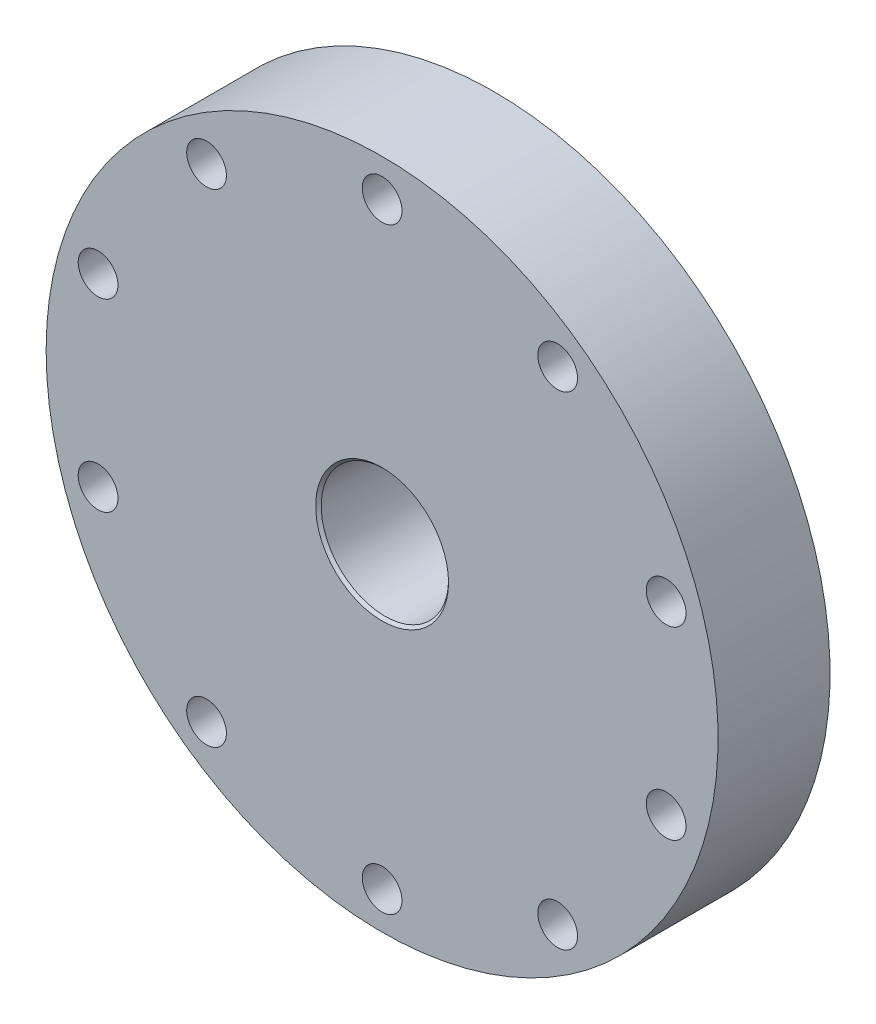
ISO-10303-21;
HEADER;
FILE_DESCRIPTION(('STEP AP214'),'2;1');
FILE_NAME('part.step','',(''),(''),'','','');
FILE_SCHEMA(('AUTOMOTIVE_DESIGN { 1 0 10303 214 1 1 1 1 }'));
ENDSEC;
DATA;
#1=APPLICATION_CONTEXT('core data for automotive mechanical design processes');
#2=APPLICATION_PROTOCOL_DEFINITION('international standard','automotive_design',2000,#1);
#3=PRODUCT_CONTEXT('',#1,'mechanical');
#4=PRODUCT('Part','Part','',(#3));
#5=PRODUCT_RELATED_PRODUCT_CATEGORY('part','',(#4));
#6=PRODUCT_DEFINITION_FORMATION('','',#4);
#7=PRODUCT_DEFINITION_CONTEXT('part definition',#1,'design');
#8=PRODUCT_DEFINITION('design','',#6,#7);
#9=PRODUCT_DEFINITION_SHAPE('','',#8);
#10=(LENGTH_UNIT() NAMED_UNIT(*) SI_UNIT(.MILLI.,.METRE.));
#11=(NAMED_UNIT(*) PLANE_ANGLE_UNIT() SI_UNIT($,.RADIAN.));
#12=(NAMED_UNIT(*) SI_UNIT($,.STERADIAN.) SOLID_ANGLE_UNIT());
#13=UNCERTAINTY_MEASURE_WITH_UNIT(LENGTH_MEASURE(1.E-05),#10,'distance_accuracy_value','');
#14=(GEOMETRIC_REPRESENTATION_CONTEXT(3) GLOBAL_UNCERTAINTY_ASSIGNED_CONTEXT((#13)) GLOBAL_UNIT_ASSIGNED_CONTEXT((#10,
#11,#12)) REPRESENTATION_CONTEXT('',''));
#15=CARTESIAN_POINT('',(0.,0.,0.));
#16=DIRECTION('',(0.,0.,1.));
#17=DIRECTION('',(1.,0.,0.));
#18=AXIS2_PLACEMENT_3D('',#15,#16,#17);
#19=CARTESIAN_POINT('',(0.,0.,19.05));
#20=DIRECTION('',(0.,0.,-1.));
#21=DIRECTION('',(-1.,0.,0.));
#22=AXIS2_PLACEMENT_3D('',#19,#20,#21);
#23=CYLINDRICAL_SURFACE('',#22,57.15);
#24=CARTESIAN_POINT('',(0.,0.,19.05));
#25=DIRECTION('',(0.,0.,1.));
#26=DIRECTION('',(1.,0.,0.));
#27=AXIS2_PLACEMENT_3D('',#24,#25,#26);
#28=CIRCLE('',#27,57.15);
#29=CARTESIAN_POINT('',(-57.15,0.,19.05));
#30=VERTEX_POINT('',#29);
#31=EDGE_CURVE('E38',#30,#30,#28,.T.);
#32=CARTESIAN_POINT('',(0.,0.,0.));
#33=DIRECTION('',(0.,0.,1.));
#34=DIRECTION('',(1.,0.,0.));
#35=AXIS2_PLACEMENT_3D('',#32,#33,#34);
#36=CIRCLE('',#35,57.15);
#37=CARTESIAN_POINT('',(-57.15,0.,0.));
#38=VERTEX_POINT('',#37);
#39=EDGE_CURVE('E42',#38,#38,#36,.T.);
#40=CARTESIAN_POINT('',(-57.15,0.,19.05));
#41=CARTESIAN_POINT('',(-57.15,0.,18.8515625));
#42=CARTESIAN_POINT('',(-57.15,0.,18.653125));
#43=CARTESIAN_POINT('',(-57.15,0.,18.25625));
#44=CARTESIAN_POINT('',(-57.15,0.,18.0578125));
#45=CARTESIAN_POINT('',(-57.15,0.,17.6609375));
#46=CARTESIAN_POINT('',(-57.15,0.,17.4625));
#47=CARTESIAN_POINT('',(-57.15,0.,17.065625));
#48=CARTESIAN_POINT('',(-57.15,0.,16.8671875));
#49=CARTESIAN_POINT('',(-57.15,0.,16.4703125));
#50=CARTESIAN_POINT('',(-57.15,0.,16.271875));
#51=CARTESIAN_POINT('',(-57.15,0.,15.875));
#52=CARTESIAN_POINT('',(-57.15,0.,15.6765625));
#53=CARTESIAN_POINT('',(-57.15,0.,15.2796875));
#54=CARTESIAN_POINT('',(-57.15,0.,15.08125));
#55=CARTESIAN_POINT('',(-57.15,0.,14.684375));
#56=CARTESIAN_POINT('',(-57.15,0.,14.4859375));
#57=CARTESIAN_POINT('',(-57.15,0.,14.0890625));
#58=CARTESIAN_POINT('',(-57.15,0.,13.890625));
#59=CARTESIAN_POINT('',(-57.15,0.,13.49375));
#60=CARTESIAN_POINT('',(-57.15,0.,13.2953125));
#61=CARTESIAN_POINT('',(-57.15,0.,12.8984375));
#62=CARTESIAN_POINT('',(-57.15,0.,12.7));
#63=CARTESIAN_POINT('',(-57.15,0.,12.303125));
#64=CARTESIAN_POINT('',(-57.15,0.,12.1046875));
#65=CARTESIAN_POINT('',(-57.15,0.,11.7078125));
#66=CARTESIAN_POINT('',(-57.15,0.,11.509375));
#67=CARTESIAN_POINT('',(-57.15,0.,11.1125));
#68=CARTESIAN_POINT('',(-57.15,0.,10.9140625));
#69=CARTESIAN_POINT('',(-57.15,0.,10.5171875));
#70=CARTESIAN_POINT('',(-57.15,0.,10.31875));
#71=CARTESIAN_POINT('',(-57.15,0.,9.921875));
#72=CARTESIAN_POINT('',(-57.15,0.,9.7234375));
#73=CARTESIAN_POINT('',(-57.15,0.,9.3265625));
#74=CARTESIAN_POINT('',(-57.15,0.,9.128125));
#75=CARTESIAN_POINT('',(-57.15,0.,8.73125));
#76=CARTESIAN_POINT('',(-57.15,0.,8.5328125));
#77=CARTESIAN_POINT('',(-57.15,0.,8.1359375));
#78=CARTESIAN_POINT('',(-57.15,0.,7.9375));
#79=CARTESIAN_POINT('',(-57.15,0.,7.540625));
#80=CARTESIAN_POINT('',(-57.15,0.,7.3421875));
#81=CARTESIAN_POINT('',(-57.15,0.,6.9453125));
#82=CARTESIAN_POINT('',(-57.15,0.,6.746875));
#83=CARTESIAN_POINT('',(-57.15,0.,6.35));
#84=CARTESIAN_POINT('',(-57.15,0.,6.1515625));
#85=CARTESIAN_POINT('',(-57.15,0.,5.7546875));
#86=CARTESIAN_POINT('',(-57.15,0.,5.55625));
#87=CARTESIAN_POINT('',(-57.15,0.,5.159375));
#88=CARTESIAN_POINT('',(-57.15,0.,4.9609375));
#89=CARTESIAN_POINT('',(-57.15,0.,4.5640625));
#90=CARTESIAN_POINT('',(-57.15,0.,4.365625));
#91=CARTESIAN_POINT('',(-57.15,0.,3.96875));
#92=CARTESIAN_POINT('',(-57.15,0.,3.7703125));
#93=CARTESIAN_POINT('',(-57.15,0.,3.3734375));
#94=CARTESIAN_POINT('',(-57.15,0.,3.175));
#95=CARTESIAN_POINT('',(-57.15,0.,2.778125));
#96=CARTESIAN_POINT('',(-57.15,0.,2.5796875));
#97=CARTESIAN_POINT('',(-57.15,0.,2.1828125));
#98=CARTESIAN_POINT('',(-57.15,0.,1.984375));
#99=CARTESIAN_POINT('',(-57.15,0.,1.5875));
#100=CARTESIAN_POINT('',(-57.15,0.,1.3890625));
#101=CARTESIAN_POINT('',(-57.15,0.,0.992187500000001));
#102=CARTESIAN_POINT('',(-57.15,0.,0.793750000000001));
#103=CARTESIAN_POINT('',(-57.15,0.,0.396875));
#104=CARTESIAN_POINT('',(-57.15,0.,0.1984375));
#105=CARTESIAN_POINT('',(-57.15,0.,0.));
#106=B_SPLINE_CURVE_WITH_KNOTS('',3,(#40,#41,#42,#43,#44,#45,#46,#47,#48,#49,#50,#51,#52,#53,
#54,#55,#56,#57,#58,#59,#60,#61,#62,#63,#64,#65,#66,#67,#68,#69,#70,#71,#72,#73,#74,#75,#76,#77,
#78,#79,#80,#81,#82,#83,#84,#85,#86,#87,#88,#89,#90,#91,#92,#93,#94,#95,#96,#97,#98,#99,#100,
#101,#102,#103,#104,#105),.UNSPECIFIED.,.F.,.F.,(4,2,2,2,2,2,2,2,2,2,2,2,2,2,2,2,2,2,2,2,2,2,2,
2,2,2,2,2,2,2,2,2,4),(0.,0.595312499999997,1.190625,1.7859375,2.38125,2.9765625,3.571875,
4.1671875,4.7625,5.3578125,5.953125,6.5484375,7.14375,7.7390625,8.334375,8.9296875,9.525,
10.1203125,10.715625,11.3109375,11.90625,12.5015625,13.096875,13.6921875,14.2875,14.8828125,
15.478125,16.0734375,16.66875,17.2640625,17.859375,18.4546875,19.05),.UNSPECIFIED.);
#107=EDGE_CURVE('BSEAM32',#30,#38,#106,.T.);
#108=ORIENTED_EDGE('',*,*,#31,.F.);
#109=ORIENTED_EDGE('',*,*,#39,.T.);
#110=ORIENTED_EDGE('',*,*,#107,.T.);
#111=ORIENTED_EDGE('',*,*,#107,.F.);
#112=EDGE_LOOP('',(#108,#110,#109,#111));
#113=FACE_BOUND('',#112,.T.);
#114=ADVANCED_FACE('F32',(#113),#23,.T.);
#115=CARTESIAN_POINT('',(0.,0.,19.05));
#116=DIRECTION('',(0.,0.,1.));
#117=DIRECTION('',(1.,0.,0.));
#118=AXIS2_PLACEMENT_3D('',#115,#116,#117);
#119=PLANE('',#118);
#120=CARTESIAN_POINT('',(0.,0.,19.05));
#121=DIRECTION('',(0.,0.,1.));
#122=DIRECTION('',(1.,0.,0.));
#123=AXIS2_PLACEMENT_3D('',#120,#121,#122);
#124=CIRCLE('',#123,11.303);
#125=CARTESIAN_POINT('',(11.303,0.,19.05));
#126=VERTEX_POINT('',#125);
#127=EDGE_CURVE('E132',#126,#126,#124,.T.);
#128=ORIENTED_EDGE('',*,*,#127,.F.);
#129=EDGE_LOOP('',(#128));
#130=FACE_BOUND('',#129,.T.);
#131=CARTESIAN_POINT('',(0.,50.8,19.05));
#132=DIRECTION('',(0.,0.,1.));
#133=DIRECTION('',(1.,0.,0.));
#134=AXIS2_PLACEMENT_3D('',#131,#132,#133);
#135=CIRCLE('',#134,3.37819999999999);
#136=CARTESIAN_POINT('',(3.37819999999999,50.8,19.05));
#137=VERTEX_POINT('',#136);
#138=EDGE_CURVE('E136',#137,#137,#135,.T.);
#139=ORIENTED_EDGE('',*,*,#138,.F.);
#140=EDGE_LOOP('',(#139));
#141=FACE_BOUND('',#140,.T.);
#142=CARTESIAN_POINT('',(29.8594908164576,41.0980633142473,19.05));
#143=DIRECTION('',(0.,0.,1.));
#144=DIRECTION('',(1.,0.,0.));
#145=AXIS2_PLACEMENT_3D('',#142,#143,#144);
#146=CIRCLE('',#145,3.37819999999999);
#147=CARTESIAN_POINT('',(33.2376908164576,41.0980633142473,19.05));
#148=VERTEX_POINT('',#147);
#149=EDGE_CURVE('E140',#148,#148,#146,.T.);
#150=ORIENTED_EDGE('',*,*,#149,.F.);
#151=EDGE_LOOP('',(#150));
#152=FACE_BOUND('',#151,.T.);
#153=CARTESIAN_POINT('',(48.3136710277938,15.6980633142473,19.05));
#154=DIRECTION('',(0.,0.,1.));
#155=DIRECTION('',(1.,0.,0.));
#156=AXIS2_PLACEMENT_3D('',#153,#154,#155);
#157=CIRCLE('',#156,3.37819999999999);
#158=CARTESIAN_POINT('',(51.6918710277938,15.6980633142473,19.05));
#159=VERTEX_POINT('',#158);
#160=EDGE_CURVE('E78',#159,#159,#157,.T.);
#161=ORIENTED_EDGE('',*,*,#160,.F.);
#162=EDGE_LOOP('',(#161));
#163=FACE_BOUND('',#162,.T.);
#164=CARTESIAN_POINT('',(48.3136710277938,-15.6980633142473,19.05));
#165=DIRECTION('',(0.,0.,1.));
#166=DIRECTION('',(1.,0.,0.));
#167=AXIS2_PLACEMENT_3D('',#164,#165,#166);
#168=CIRCLE('',#167,3.37819999999999);
#169=CARTESIAN_POINT('',(51.6918710277938,-15.6980633142473,19.05));
#170=VERTEX_POINT('',#169);
#171=EDGE_CURVE('E67',#170,#170,#168,.T.);
#172=ORIENTED_EDGE('',*,*,#171,.F.);
#173=EDGE_LOOP('',(#172));
#174=FACE_BOUND('',#173,.T.);
#175=CARTESIAN_POINT('',(29.8594908164576,-41.0980633142473,19.05));
#176=DIRECTION('',(0.,0.,1.));
#177=DIRECTION('',(1.,0.,0.));
#178=AXIS2_PLACEMENT_3D('',#175,#176,#177);
#179=CIRCLE('',#178,3.37819999999999);
#180=CARTESIAN_POINT('',(33.2376908164576,-41.0980633142473,19.05));
#181=VERTEX_POINT('',#180);
#182=EDGE_CURVE('E64',#181,#181,#179,.T.);
#183=ORIENTED_EDGE('',*,*,#182,.F.);
#184=EDGE_LOOP('',(#183));
#185=FACE_BOUND('',#184,.T.);
#186=CARTESIAN_POINT('',(0.,-50.8,19.05));
#187=DIRECTION('',(0.,0.,1.));
#188=DIRECTION('',(1.,0.,0.));
#189=AXIS2_PLACEMENT_3D('',#186,#187,#188);
#190=CIRCLE('',#189,3.37819999999999);
#191=CARTESIAN_POINT('',(3.3782,-50.8,19.05));
#192=VERTEX_POINT('',#191);
#193=EDGE_CURVE('E63',#192,#192,#190,.T.);
#194=ORIENTED_EDGE('',*,*,#193,.F.);
#195=EDGE_LOOP('',(#194));
#196=FACE_BOUND('',#195,.T.);
#197=CARTESIAN_POINT('',(-29.8594908164576,-41.0980633142473,19.05));
#198=DIRECTION('',(0.,0.,1.));
#199=DIRECTION('',(1.,0.,0.));
#200=AXIS2_PLACEMENT_3D('',#197,#198,#199);
#201=CIRCLE('',#200,3.37819999999999);
#202=CARTESIAN_POINT('',(-26.4812908164576,-41.0980633142473,19.05));
#203=VERTEX_POINT('',#202);
#204=EDGE_CURVE('E60',#203,#203,#201,.T.);
#205=ORIENTED_EDGE('',*,*,#204,.F.);
#206=EDGE_LOOP('',(#205));
#207=FACE_BOUND('',#206,.T.);
#208=CARTESIAN_POINT('',(-48.3136710277938,-15.6980633142473,19.05));
#209=DIRECTION('',(0.,0.,1.));
#210=DIRECTION('',(1.,0.,0.));
#211=AXIS2_PLACEMENT_3D('',#208,#209,#210);
#212=CIRCLE('',#211,3.37819999999999);
#213=CARTESIAN_POINT('',(-44.9354710277938,-15.6980633142473,19.05));
#214=VERTEX_POINT('',#213);
#215=EDGE_CURVE('E56',#214,#214,#212,.T.);
#216=ORIENTED_EDGE('',*,*,#215,.F.);
#217=EDGE_LOOP('',(#216));
#218=FACE_BOUND('',#217,.T.);
#219=CARTESIAN_POINT('',(-48.3136710277938,15.6980633142473,19.05));
#220=DIRECTION('',(0.,0.,1.));
#221=DIRECTION('',(1.,0.,0.));
#222=AXIS2_PLACEMENT_3D('',#219,#220,#221);
#223=CIRCLE('',#222,3.37819999999999);
#224=CARTESIAN_POINT('',(-44.9354710277938,15.6980633142473,19.05));
#225=VERTEX_POINT('',#224);
#226=EDGE_CURVE('E55',#225,#225,#223,.T.);
#227=ORIENTED_EDGE('',*,*,#226,.F.);
#228=EDGE_LOOP('',(#227));
#229=FACE_BOUND('',#228,.T.);
#230=CARTESIAN_POINT('',(-29.8594908164576,41.0980633142473,19.05));
#231=DIRECTION('',(0.,0.,1.));
#232=DIRECTION('',(1.,0.,0.));
#233=AXIS2_PLACEMENT_3D('',#230,#231,#232);
#234=CIRCLE('',#233,3.37819999999999);
#235=CARTESIAN_POINT('',(-26.4812908164577,41.0980633142473,19.05));
#236=VERTEX_POINT('',#235);
#237=EDGE_CURVE('E95',#236,#236,#234,.T.);
#238=ORIENTED_EDGE('',*,*,#237,.F.);
#239=EDGE_LOOP('',(#238));
#240=FACE_BOUND('',#239,.T.);
#241=ORIENTED_EDGE('',*,*,#31,.T.);
#242=EDGE_LOOP('',(#241));
#243=FACE_BOUND('',#242,.T.);
#244=ADVANCED_FACE('F116',(#130,#141,#152,#163,#174,#185,#196,#207,#218,#229,#240,#243),#119,.T.);
#245=CARTESIAN_POINT('',(0.,0.,0.));
#246=DIRECTION('',(0.,0.,1.));
#247=DIRECTION('',(1.,0.,0.));
#248=AXIS2_PLACEMENT_3D('',#245,#246,#247);
#249=PLANE('',#248);
#250=CARTESIAN_POINT('',(0.,0.,0.));
#251=DIRECTION('',(0.,0.,1.));
#252=DIRECTION('',(1.,0.,0.));
#253=AXIS2_PLACEMENT_3D('',#250,#251,#252);
#254=CIRCLE('',#253,44.45);
#255=CARTESIAN_POINT('',(44.45,0.,0.));
#256=VERTEX_POINT('',#255);
#257=EDGE_CURVE('E10',#256,#256,#254,.F.);
#258=ORIENTED_EDGE('',*,*,#257,.F.);
#259=EDGE_LOOP('',(#258));
#260=FACE_BOUND('',#259,.T.);
#261=CARTESIAN_POINT('',(0.,50.8,0.));
#262=DIRECTION('',(0.,0.,1.));
#263=DIRECTION('',(1.,0.,0.));
#264=AXIS2_PLACEMENT_3D('',#261,#262,#263);
#265=CIRCLE('',#264,3.37819999999999);
#266=CARTESIAN_POINT('',(3.37819999999999,50.8,0.));
#267=VERTEX_POINT('',#266);
#268=EDGE_CURVE('E246',#267,#267,#265,.T.);
#269=ORIENTED_EDGE('',*,*,#268,.T.);
#270=EDGE_LOOP('',(#269));
#271=FACE_BOUND('',#270,.T.);
#272=CARTESIAN_POINT('',(29.8594908164576,41.0980633142473,0.));
#273=DIRECTION('',(0.,0.,1.));
#274=DIRECTION('',(1.,0.,0.));
#275=AXIS2_PLACEMENT_3D('',#272,#273,#274);
#276=CIRCLE('',#275,3.37819999999999);
#277=CARTESIAN_POINT('',(33.2376908164576,41.0980633142473,0.));
#278=VERTEX_POINT('',#277);
#279=EDGE_CURVE('E250',#278,#278,#276,.T.);
#280=ORIENTED_EDGE('',*,*,#279,.T.);
#281=EDGE_LOOP('',(#280));
#282=FACE_BOUND('',#281,.T.);
#283=CARTESIAN_POINT('',(48.3136710277938,15.6980633142473,0.));
#284=DIRECTION('',(0.,0.,1.));
#285=DIRECTION('',(1.,0.,0.));
#286=AXIS2_PLACEMENT_3D('',#283,#284,#285);
#287=CIRCLE('',#286,3.37819999999999);
#288=CARTESIAN_POINT('',(51.6918710277938,15.6980633142473,0.));
#289=VERTEX_POINT('',#288);
#290=EDGE_CURVE('E73',#289,#289,#287,.T.);
#291=ORIENTED_EDGE('',*,*,#290,.T.);
#292=EDGE_LOOP('',(#291));
#293=FACE_BOUND('',#292,.T.);
#294=CARTESIAN_POINT('',(48.3136710277938,-15.6980633142473,0.));
#295=DIRECTION('',(0.,0.,1.));
#296=DIRECTION('',(1.,0.,0.));
#297=AXIS2_PLACEMENT_3D('',#294,#295,#296);
#298=CIRCLE('',#297,3.37819999999999);
#299=CARTESIAN_POINT('',(51.6918710277938,-15.6980633142473,0.));
#300=VERTEX_POINT('',#299);
#301=EDGE_CURVE('E65',#300,#300,#298,.T.);
#302=ORIENTED_EDGE('',*,*,#301,.T.);
#303=EDGE_LOOP('',(#302));
#304=FACE_BOUND('',#303,.T.);
#305=CARTESIAN_POINT('',(29.8594908164576,-41.0980633142473,0.));
#306=DIRECTION('',(0.,0.,1.));
#307=DIRECTION('',(1.,0.,0.));
#308=AXIS2_PLACEMENT_3D('',#305,#306,#307);
#309=CIRCLE('',#308,3.37819999999999);
#310=CARTESIAN_POINT('',(33.2376908164576,-41.0980633142473,0.));
#311=VERTEX_POINT('',#310);
#312=EDGE_CURVE('E61',#311,#311,#309,.T.);
#313=ORIENTED_EDGE('',*,*,#312,.T.);
#314=EDGE_LOOP('',(#313));
#315=FACE_BOUND('',#314,.T.);
#316=CARTESIAN_POINT('',(0.,-50.8,0.));
#317=DIRECTION('',(0.,0.,1.));
#318=DIRECTION('',(1.,0.,0.));
#319=AXIS2_PLACEMENT_3D('',#316,#317,#318);
#320=CIRCLE('',#319,3.37819999999999);
#321=CARTESIAN_POINT('',(3.3782,-50.8,0.));
#322=VERTEX_POINT('',#321);
#323=EDGE_CURVE('E84',#322,#322,#320,.T.);
#324=ORIENTED_EDGE('',*,*,#323,.T.);
#325=EDGE_LOOP('',(#324));
#326=FACE_BOUND('',#325,.T.);
#327=CARTESIAN_POINT('',(-29.8594908164576,-41.0980633142473,0.));
#328=DIRECTION('',(0.,0.,1.));
#329=DIRECTION('',(1.,0.,0.));
#330=AXIS2_PLACEMENT_3D('',#327,#328,#329);
#331=CIRCLE('',#330,3.37819999999999);
#332=CARTESIAN_POINT('',(-26.4812908164576,-41.0980633142473,0.));
#333=VERTEX_POINT('',#332);
#334=EDGE_CURVE('E57',#333,#333,#331,.T.);
#335=ORIENTED_EDGE('',*,*,#334,.T.);
#336=EDGE_LOOP('',(#335));
#337=FACE_BOUND('',#336,.T.);
#338=CARTESIAN_POINT('',(-48.3136710277938,-15.6980633142473,0.));
#339=DIRECTION('',(0.,0.,1.));
#340=DIRECTION('',(1.,0.,0.));
#341=AXIS2_PLACEMENT_3D('',#338,#339,#340);
#342=CIRCLE('',#341,3.37819999999999);
#343=CARTESIAN_POINT('',(-44.9354710277938,-15.6980633142473,0.));
#344=VERTEX_POINT('',#343);
#345=EDGE_CURVE('E52',#344,#344,#342,.T.);
#346=ORIENTED_EDGE('',*,*,#345,.T.);
#347=EDGE_LOOP('',(#346));
#348=FACE_BOUND('',#347,.T.);
#349=CARTESIAN_POINT('',(-48.3136710277938,15.6980633142473,0.));
#350=DIRECTION('',(0.,0.,1.));
#351=DIRECTION('',(1.,0.,0.));
#352=AXIS2_PLACEMENT_3D('',#349,#350,#351);
#353=CIRCLE('',#352,3.37819999999999);
#354=CARTESIAN_POINT('',(-44.9354710277938,15.6980633142473,0.));
#355=VERTEX_POINT('',#354);
#356=EDGE_CURVE('E93',#355,#355,#353,.T.);
#357=ORIENTED_EDGE('',*,*,#356,.T.);
#358=EDGE_LOOP('',(#357));
#359=FACE_BOUND('',#358,.T.);
#360=CARTESIAN_POINT('',(-29.8594908164576,41.0980633142473,0.));
#361=DIRECTION('',(0.,0.,1.));
#362=DIRECTION('',(1.,0.,0.));
#363=AXIS2_PLACEMENT_3D('',#360,#361,#362);
#364=CIRCLE('',#363,3.37819999999999);
#365=CARTESIAN_POINT('',(-26.4812908164577,41.0980633142473,0.));
#366=VERTEX_POINT('',#365);
#367=EDGE_CURVE('E47',#366,#366,#364,.T.);
#368=ORIENTED_EDGE('',*,*,#367,.T.);
#369=EDGE_LOOP('',(#368));
#370=FACE_BOUND('',#369,.T.);
#371=ORIENTED_EDGE('',*,*,#39,.F.);
#372=EDGE_LOOP('',(#371));
#373=FACE_BOUND('',#372,.T.);
#374=ADVANCED_FACE('F102',(#260,#271,#282,#293,#304,#315,#326,#337,#348,#359,#370,#373),#249,.F.);
#375=CARTESIAN_POINT('',(-29.8594908164576,41.0980633142473,19.05));
#376=DIRECTION('',(0.,0.,1.));
#377=DIRECTION('',(1.,0.,0.));
#378=AXIS2_PLACEMENT_3D('',#375,#376,#377);
#379=CYLINDRICAL_SURFACE('',#378,3.37819999999999);
#380=ORIENTED_EDGE('',*,*,#237,.T.);
#381=EDGE_LOOP('',(#380));
#382=FACE_BOUND('',#381,.T.);
#383=ORIENTED_EDGE('',*,*,#367,.F.);
#384=EDGE_LOOP('',(#383));
#385=FACE_BOUND('',#384,.T.);
#386=ADVANCED_FACE('F105',(#382,#385),#379,.F.);
#387=CARTESIAN_POINT('',(-48.3136710277938,15.6980633142473,19.05));
#388=DIRECTION('',(0.,0.,1.));
#389=DIRECTION('',(1.,0.,0.));
#390=AXIS2_PLACEMENT_3D('',#387,#388,#389);
#391=CYLINDRICAL_SURFACE('',#390,3.37819999999999);
#392=ORIENTED_EDGE('',*,*,#226,.T.);
#393=EDGE_LOOP('',(#392));
#394=FACE_BOUND('',#393,.T.);
#395=ORIENTED_EDGE('',*,*,#356,.F.);
#396=EDGE_LOOP('',(#395));
#397=FACE_BOUND('',#396,.T.);
#398=ADVANCED_FACE('F107',(#394,#397),#391,.F.);
#399=CARTESIAN_POINT('',(-48.3136710277938,-15.6980633142473,19.05));
#400=DIRECTION('',(0.,0.,1.));
#401=DIRECTION('',(1.,0.,0.));
#402=AXIS2_PLACEMENT_3D('',#399,#400,#401);
#403=CYLINDRICAL_SURFACE('',#402,3.37819999999999);
#404=ORIENTED_EDGE('',*,*,#215,.T.);
#405=EDGE_LOOP('',(#404));
#406=FACE_BOUND('',#405,.T.);
#407=ORIENTED_EDGE('',*,*,#345,.F.);
#408=EDGE_LOOP('',(#407));
#409=FACE_BOUND('',#408,.T.);
#410=ADVANCED_FACE('F113',(#406,#409),#403,.F.);
#411=CARTESIAN_POINT('',(-29.8594908164576,-41.0980633142473,19.05));
#412=DIRECTION('',(0.,0.,1.));
#413=DIRECTION('',(1.,0.,0.));
#414=AXIS2_PLACEMENT_3D('',#411,#412,#413);
#415=CYLINDRICAL_SURFACE('',#414,3.37819999999999);
#416=ORIENTED_EDGE('',*,*,#204,.T.);
#417=EDGE_LOOP('',(#416));
#418=FACE_BOUND('',#417,.T.);
#419=ORIENTED_EDGE('',*,*,#334,.F.);
#420=EDGE_LOOP('',(#419));
#421=FACE_BOUND('',#420,.T.);
#422=ADVANCED_FACE('F161',(#418,#421),#415,.F.);
#423=CARTESIAN_POINT('',(0.,-50.8,19.05));
#424=DIRECTION('',(0.,0.,1.));
#425=DIRECTION('',(1.,0.,0.));
#426=AXIS2_PLACEMENT_3D('',#423,#424,#425);
#427=CYLINDRICAL_SURFACE('',#426,3.37819999999999);
#428=ORIENTED_EDGE('',*,*,#193,.T.);
#429=EDGE_LOOP('',(#428));
#430=FACE_BOUND('',#429,.T.);
#431=ORIENTED_EDGE('',*,*,#323,.F.);
#432=EDGE_LOOP('',(#431));
#433=FACE_BOUND('',#432,.T.);
#434=ADVANCED_FACE('F168',(#430,#433),#427,.F.);
#435=CARTESIAN_POINT('',(29.8594908164576,-41.0980633142473,19.05));
#436=DIRECTION('',(0.,0.,1.));
#437=DIRECTION('',(1.,0.,0.));
#438=AXIS2_PLACEMENT_3D('',#435,#436,#437);
#439=CYLINDRICAL_SURFACE('',#438,3.37819999999999);
#440=ORIENTED_EDGE('',*,*,#182,.T.);
#441=EDGE_LOOP('',(#440));
#442=FACE_BOUND('',#441,.T.);
#443=ORIENTED_EDGE('',*,*,#312,.F.);
#444=EDGE_LOOP('',(#443));
#445=FACE_BOUND('',#444,.T.);
#446=ADVANCED_FACE('F174',(#442,#445),#439,.F.);
#447=CARTESIAN_POINT('',(48.3136710277938,-15.6980633142473,19.05));
#448=DIRECTION('',(0.,0.,1.));
#449=DIRECTION('',(1.,0.,0.));
#450=AXIS2_PLACEMENT_3D('',#447,#448,#449);
#451=CYLINDRICAL_SURFACE('',#450,3.37819999999999);
#452=ORIENTED_EDGE('',*,*,#171,.T.);
#453=EDGE_LOOP('',(#452));
#454=FACE_BOUND('',#453,.T.);
#455=ORIENTED_EDGE('',*,*,#301,.F.);
#456=EDGE_LOOP('',(#455));
#457=FACE_BOUND('',#456,.T.);
#458=ADVANCED_FACE('F178',(#454,#457),#451,.F.);
#459=CARTESIAN_POINT('',(48.3136710277938,15.6980633142473,19.05));
#460=DIRECTION('',(0.,0.,1.));
#461=DIRECTION('',(1.,0.,0.));
#462=AXIS2_PLACEMENT_3D('',#459,#460,#461);
#463=CYLINDRICAL_SURFACE('',#462,3.37819999999999);
#464=ORIENTED_EDGE('',*,*,#160,.T.);
#465=EDGE_LOOP('',(#464));
#466=FACE_BOUND('',#465,.T.);
#467=ORIENTED_EDGE('',*,*,#290,.F.);
#468=EDGE_LOOP('',(#467));
#469=FACE_BOUND('',#468,.T.);
#470=ADVANCED_FACE('F182',(#466,#469),#463,.F.);
#471=CARTESIAN_POINT('',(29.8594908164576,41.0980633142473,19.05));
#472=DIRECTION('',(0.,0.,1.));
#473=DIRECTION('',(1.,0.,0.));
#474=AXIS2_PLACEMENT_3D('',#471,#472,#473);
#475=CYLINDRICAL_SURFACE('',#474,3.37819999999999);
#476=ORIENTED_EDGE('',*,*,#149,.T.);
#477=EDGE_LOOP('',(#476));
#478=FACE_BOUND('',#477,.T.);
#479=ORIENTED_EDGE('',*,*,#279,.F.);
#480=EDGE_LOOP('',(#479));
#481=FACE_BOUND('',#480,.T.);
#482=ADVANCED_FACE('F185',(#478,#481),#475,.F.);
#483=CARTESIAN_POINT('',(0.,50.8,19.05));
#484=DIRECTION('',(0.,0.,1.));
#485=DIRECTION('',(1.,0.,0.));
#486=AXIS2_PLACEMENT_3D('',#483,#484,#485);
#487=CYLINDRICAL_SURFACE('',#486,3.37819999999999);
#488=ORIENTED_EDGE('',*,*,#138,.T.);
#489=EDGE_LOOP('',(#488));
#490=FACE_BOUND('',#489,.T.);
#491=ORIENTED_EDGE('',*,*,#268,.F.);
#492=EDGE_LOOP('',(#491));
#493=FACE_BOUND('',#492,.T.);
#494=ADVANCED_FACE('F189',(#490,#493),#487,.F.);
#495=CARTESIAN_POINT('',(0.,0.,-2.38125));
#496=DIRECTION('',(0.,0.,1.));
#497=DIRECTION('',(1.,0.,0.));
#498=AXIS2_PLACEMENT_3D('',#495,#496,#497);
#499=CYLINDRICAL_SURFACE('',#498,44.45);
#500=CARTESIAN_POINT('',(0.,0.,-2.38125));
#501=DIRECTION('',(0.,0.,-1.));
#502=DIRECTION('',(-1.,0.,0.));
#503=AXIS2_PLACEMENT_3D('',#500,#501,#502);
#504=CIRCLE('',#503,44.45);
#505=CARTESIAN_POINT('',(44.45,0.,-2.38125));
#506=VERTEX_POINT('',#505);
#507=EDGE_CURVE('E242',#506,#506,#504,.T.);
#508=CARTESIAN_POINT('',(44.45,0.,-2.38125));
#509=CARTESIAN_POINT('',(44.45,0.,-2.3564453125));
#510=CARTESIAN_POINT('',(44.45,0.,-2.331640625));
#511=CARTESIAN_POINT('',(44.45,0.,-2.28203125));
#512=CARTESIAN_POINT('',(44.45,0.,-2.2572265625));
#513=CARTESIAN_POINT('',(44.45,0.,-2.2076171875));
#514=CARTESIAN_POINT('',(44.45,0.,-2.1828125));
#515=CARTESIAN_POINT('',(44.45,0.,-2.133203125));
#516=CARTESIAN_POINT('',(44.45,0.,-2.1083984375));
#517=CARTESIAN_POINT('',(44.45,0.,-2.0587890625));
#518=CARTESIAN_POINT('',(44.45,0.,-2.033984375));
#519=CARTESIAN_POINT('',(44.45,0.,-1.984375));
#520=CARTESIAN_POINT('',(44.45,0.,-1.9595703125));
#521=CARTESIAN_POINT('',(44.45,0.,-1.9099609375));
#522=CARTESIAN_POINT('',(44.45,0.,-1.88515625));
#523=CARTESIAN_POINT('',(44.45,0.,-1.835546875));
#524=CARTESIAN_POINT('',(44.45,0.,-1.8107421875));
#525=CARTESIAN_POINT('',(44.45,0.,-1.7611328125));
#526=CARTESIAN_POINT('',(44.45,0.,-1.736328125));
#527=CARTESIAN_POINT('',(44.45,0.,-1.68671875));
#528=CARTESIAN_POINT('',(44.45,0.,-1.6619140625));
#529=CARTESIAN_POINT('',(44.45,0.,-1.6123046875));
#530=CARTESIAN_POINT('',(44.45,0.,-1.5875));
#531=CARTESIAN_POINT('',(44.45,0.,-1.537890625));
#532=CARTESIAN_POINT('',(44.45,0.,-1.5130859375));
#533=CARTESIAN_POINT('',(44.45,0.,-1.4634765625));
#534=CARTESIAN_POINT('',(44.45,0.,-1.438671875));
#535=CARTESIAN_POINT('',(44.45,0.,-1.3890625));
#536=CARTESIAN_POINT('',(44.45,0.,-1.3642578125));
#537=CARTESIAN_POINT('',(44.45,0.,-1.3146484375));
#538=CARTESIAN_POINT('',(44.45,0.,-1.28984375));
#539=CARTESIAN_POINT('',(44.45,0.,-1.240234375));
#540=CARTESIAN_POINT('',(44.45,0.,-1.2154296875));
#541=CARTESIAN_POINT('',(44.45,0.,-1.1658203125));
#542=CARTESIAN_POINT('',(44.45,0.,-1.141015625));
#543=CARTESIAN_POINT('',(44.45,0.,-1.09140625));
#544=CARTESIAN_POINT('',(44.45,0.,-1.0666015625));
#545=CARTESIAN_POINT('',(44.45,0.,-1.0169921875));
#546=CARTESIAN_POINT('',(44.45,0.,-0.9921875));
#547=CARTESIAN_POINT('',(44.45,0.,-0.942578125));
#548=CARTESIAN_POINT('',(44.45,0.,-0.9177734375));
#549=CARTESIAN_POINT('',(44.45,0.,-0.8681640625));
#550=CARTESIAN_POINT('',(44.45,0.,-0.843359375));
#551=CARTESIAN_POINT('',(44.45,0.,-0.79375));
#552=CARTESIAN_POINT('',(44.45,0.,-0.7689453125));
#553=CARTESIAN_POINT('',(44.45,0.,-0.7193359375));
#554=CARTESIAN_POINT('',(44.45,0.,-0.69453125));
#555=CARTESIAN_POINT('',(44.45,0.,-0.644921875));
#556=CARTESIAN_POINT('',(44.45,0.,-0.6201171875));
#557=CARTESIAN_POINT('',(44.45,0.,-0.5705078125));
#558=CARTESIAN_POINT('',(44.45,0.,-0.545703125));
#559=CARTESIAN_POINT('',(44.45,0.,-0.49609375));
#560=CARTESIAN_POINT('',(44.45,0.,-0.4712890625));
#561=CARTESIAN_POINT('',(44.45,0.,-0.4216796875));
#562=CARTESIAN_POINT('',(44.45,0.,-0.396875));
#563=CARTESIAN_POINT('',(44.45,0.,-0.347265625));
#564=CARTESIAN_POINT('',(44.45,0.,-0.3224609375));
#565=CARTESIAN_POINT('',(44.45,0.,-0.2728515625));
#566=CARTESIAN_POINT('',(44.45,0.,-0.248046875));
#567=CARTESIAN_POINT('',(44.45,0.,-0.1984375));
#568=CARTESIAN_POINT('',(44.45,0.,-0.1736328125));
#569=CARTESIAN_POINT('',(44.45,0.,-0.1240234375));
#570=CARTESIAN_POINT('',(44.45,0.,-0.0992187500000001));
#571=CARTESIAN_POINT('',(44.45,0.,-0.049609375));
#572=CARTESIAN_POINT('',(44.45,0.,-0.0248046875));
#573=CARTESIAN_POINT('',(44.45,0.,0.));
#574=B_SPLINE_CURVE_WITH_KNOTS('',3,(#508,#509,#510,#511,#512,#513,#514,#515,#516,#517,#518,
#519,#520,#521,#522,#523,#524,#525,#526,#527,#528,#529,#530,#531,#532,#533,#534,#535,#536,#537,
#538,#539,#540,#541,#542,#543,#544,#545,#546,#547,#548,#549,#550,#551,#552,#553,#554,#555,#556,
#557,#558,#559,#560,#561,#562,#563,#564,#565,#566,#567,#568,#569,#570,#571,#572,#573),
.UNSPECIFIED.,.F.,.F.,(4,2,2,2,2,2,2,2,2,2,2,2,2,2,2,2,2,2,2,2,2,2,2,2,2,2,2,2,2,2,2,2,4),(0.,
0.0744140624999996,0.148828125,0.2232421875,0.29765625,0.3720703125,0.446484375,0.5208984375,
0.5953125,0.6697265625,0.744140625,0.8185546875,0.89296875,0.9673828125,1.041796875,
1.1162109375,1.190625,1.2650390625,1.339453125,1.4138671875,1.48828125,1.5626953125,1.637109375,
1.7115234375,1.7859375,1.8603515625,1.934765625,2.0091796875,2.08359375,2.1580078125,
2.232421875,2.3068359375,2.38125),.UNSPECIFIED.);
#575=EDGE_CURVE('BSEAM193',#506,#256,#574,.T.);
#576=ORIENTED_EDGE('',*,*,#507,.F.);
#577=ORIENTED_EDGE('',*,*,#257,.T.);
#578=ORIENTED_EDGE('',*,*,#575,.T.);
#579=ORIENTED_EDGE('',*,*,#575,.F.);
#580=EDGE_LOOP('',(#576,#578,#577,#579));
#581=FACE_BOUND('',#580,.T.);
#582=ADVANCED_FACE('F193',(#581),#499,.T.);
#583=CARTESIAN_POINT('',(0.,0.,-2.38125));
#584=DIRECTION('',(0.,0.,-1.));
#585=DIRECTION('',(-1.,0.,0.));
#586=AXIS2_PLACEMENT_3D('',#583,#584,#585);
#587=PLANE('',#586);
#588=CARTESIAN_POINT('',(0.,0.,-2.38125));
#589=DIRECTION('',(0.,0.,1.));
#590=DIRECTION('',(1.,0.,0.));
#591=AXIS2_PLACEMENT_3D('',#588,#589,#590);
#592=CIRCLE('',#591,9.5631);
#593=CARTESIAN_POINT('',(9.5631,0.,-2.38125));
#594=VERTEX_POINT('',#593);
#595=EDGE_CURVE('E227',#594,#594,#592,.T.);
#596=ORIENTED_EDGE('',*,*,#595,.T.);
#597=EDGE_LOOP('',(#596));
#598=FACE_BOUND('',#597,.T.);
#599=ORIENTED_EDGE('',*,*,#507,.T.);
#600=EDGE_LOOP('',(#599));
#601=FACE_BOUND('',#600,.T.);
#602=ADVANCED_FACE('F197',(#598,#601),#587,.T.);
#603=CARTESIAN_POINT('',(0.,0.,-1.74625000000001));
#604=DIRECTION('',(0.,0.,-1.));
#605=DIRECTION('',(-1.,0.,0.));
#606=AXIS2_PLACEMENT_3D('',#603,#604,#605);
#607=CONICAL_SURFACE('',#606,8.9281,0.785398163397457);
#608=ORIENTED_EDGE('',*,*,#595,.F.);
#609=EDGE_LOOP('',(#608));
#610=FACE_BOUND('',#609,.T.);
#611=CARTESIAN_POINT('',(0.,0.,-1.74625000000001));
#612=DIRECTION('',(0.,0.,1.));
#613=DIRECTION('',(1.,0.,0.));
#614=AXIS2_PLACEMENT_3D('',#611,#612,#613);
#615=CIRCLE('',#614,8.9281);
#616=CARTESIAN_POINT('',(8.9281,0.,-1.74625000000001));
#617=VERTEX_POINT('',#616);
#618=EDGE_CURVE('E239',#617,#617,#615,.T.);
#619=ORIENTED_EDGE('',*,*,#618,.T.);
#620=EDGE_LOOP('',(#619));
#621=FACE_BOUND('',#620,.T.);
#622=ADVANCED_FACE('F201',(#610,#621),#607,.F.);
#623=CARTESIAN_POINT('',(0.,0.,19.05));
#624=DIRECTION('',(0.,0.,1.));
#625=DIRECTION('',(1.,0.,0.));
#626=AXIS2_PLACEMENT_3D('',#623,#624,#625);
#627=CYLINDRICAL_SURFACE('',#626,8.9281);
#628=ORIENTED_EDGE('',*,*,#618,.F.);
#629=EDGE_LOOP('',(#628));
#630=FACE_BOUND('',#629,.T.);
#631=CARTESIAN_POINT('',(0.,0.,0.));
#632=DIRECTION('',(0.,0.,1.));
#633=DIRECTION('',(1.,0.,0.));
#634=AXIS2_PLACEMENT_3D('',#631,#632,#633);
#635=CIRCLE('',#634,8.9281);
#636=CARTESIAN_POINT('',(8.9281,0.,0.));
#637=VERTEX_POINT('',#636);
#638=EDGE_CURVE('E236',#637,#637,#635,.T.);
#639=ORIENTED_EDGE('',*,*,#638,.T.);
#640=EDGE_LOOP('',(#639));
#641=FACE_BOUND('',#640,.T.);
#642=ADVANCED_FACE('F205',(#630,#641),#627,.F.);
#643=CARTESIAN_POINT('',(8.9281,0.,0.));
#644=DIRECTION('',(0.,0.,-1.));
#645=DIRECTION('',(-1.,0.,0.));
#646=AXIS2_PLACEMENT_3D('',#643,#644,#645);
#647=PLANE('',#646);
#648=ORIENTED_EDGE('',*,*,#638,.F.);
#649=EDGE_LOOP('',(#648));
#650=FACE_BOUND('',#649,.T.);
#651=CARTESIAN_POINT('',(0.,0.,0.));
#652=DIRECTION('',(0.,0.,1.));
#653=DIRECTION('',(1.,0.,0.));
#654=AXIS2_PLACEMENT_3D('',#651,#652,#653);
#655=CIRCLE('',#654,10.2757643852432);
#656=CARTESIAN_POINT('',(10.2757643852432,0.,0.));
#657=VERTEX_POINT('',#656);
#658=EDGE_CURVE('E229',#657,#657,#655,.T.);
#659=ORIENTED_EDGE('',*,*,#658,.T.);
#660=EDGE_LOOP('',(#659));
#661=FACE_BOUND('',#660,.T.);
#662=ADVANCED_FACE('F209',(#650,#661),#647,.F.);
#663=CARTESIAN_POINT('',(0.,0.,18.5790459));
#664=DIRECTION('',(0.,0.,1.));
#665=DIRECTION('',(1.,0.,0.));
#666=AXIS2_PLACEMENT_3D('',#663,#664,#665);
#667=CONICAL_SURFACE('',#666,10.8320459,0.0299323966717025);
#668=ORIENTED_EDGE('',*,*,#658,.F.);
#669=EDGE_LOOP('',(#668));
#670=FACE_BOUND('',#669,.T.);
#671=CARTESIAN_POINT('',(0.,0.,18.5790459));
#672=DIRECTION('',(0.,0.,1.));
#673=DIRECTION('',(1.,0.,0.));
#674=AXIS2_PLACEMENT_3D('',#671,#672,#673);
#675=CIRCLE('',#674,10.8320459);
#676=CARTESIAN_POINT('',(10.8320459,0.,18.5790459));
#677=VERTEX_POINT('',#676);
#678=EDGE_CURVE('E226',#677,#677,#675,.T.);
#679=ORIENTED_EDGE('',*,*,#678,.T.);
#680=EDGE_LOOP('',(#679));
#681=FACE_BOUND('',#680,.T.);
#682=ADVANCED_FACE('F213',(#670,#681),#667,.F.);
#683=CARTESIAN_POINT('',(0.,0.,19.05));
#684=DIRECTION('',(0.,0.,1.));
#685=DIRECTION('',(1.,0.,0.));
#686=AXIS2_PLACEMENT_3D('',#683,#684,#685);
#687=CONICAL_SURFACE('',#686,11.303,0.785398163397448);
#688=ORIENTED_EDGE('',*,*,#678,.F.);
#689=EDGE_LOOP('',(#688));
#690=FACE_BOUND('',#689,.T.);
#691=ORIENTED_EDGE('',*,*,#127,.T.);
#692=EDGE_LOOP('',(#691));
#693=FACE_BOUND('',#692,.T.);
#694=ADVANCED_FACE('F217',(#690,#693),#687,.F.);
#695=CLOSED_SHELL('',(#114,#244,#374,#386,#398,#410,#422,#434,#446,#458,#470,#482,#494,#582,
#602,#622,#642,#662,#682,#694));
#696=MANIFOLD_SOLID_BREP('B2',#695);
#697=ADVANCED_BREP_SHAPE_REPRESENTATION('',(#18,#696),#14);
#698=SHAPE_DEFINITION_REPRESENTATION(#9,#697);
ENDSEC;
END-ISO-10303-21;
